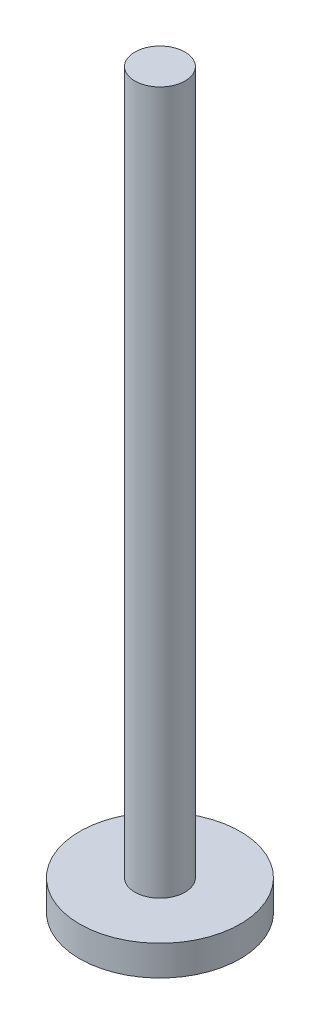
ISO-10303-21;
HEADER;
FILE_DESCRIPTION(('STEP AP214'),'2;1');
FILE_NAME('part.step','',(''),(''),'','','');
FILE_SCHEMA(('AUTOMOTIVE_DESIGN { 1 0 10303 214 1 1 1 1 }'));
ENDSEC;
DATA;
#1=APPLICATION_CONTEXT('core data for automotive mechanical design processes');
#2=APPLICATION_PROTOCOL_DEFINITION('international standard','automotive_design',2000,#1);
#3=PRODUCT_CONTEXT('',#1,'mechanical');
#4=PRODUCT('Part','Part','',(#3));
#5=PRODUCT_RELATED_PRODUCT_CATEGORY('part','',(#4));
#6=PRODUCT_DEFINITION_FORMATION('','',#4);
#7=PRODUCT_DEFINITION_CONTEXT('part definition',#1,'design');
#8=PRODUCT_DEFINITION('design','',#6,#7);
#9=PRODUCT_DEFINITION_SHAPE('','',#8);
#10=(LENGTH_UNIT() NAMED_UNIT(*) SI_UNIT(.MILLI.,.METRE.));
#11=(NAMED_UNIT(*) PLANE_ANGLE_UNIT() SI_UNIT($,.RADIAN.));
#12=(NAMED_UNIT(*) SI_UNIT($,.STERADIAN.) SOLID_ANGLE_UNIT());
#13=UNCERTAINTY_MEASURE_WITH_UNIT(LENGTH_MEASURE(1.E-05),#10,'distance_accuracy_value','');
#14=(GEOMETRIC_REPRESENTATION_CONTEXT(3) GLOBAL_UNCERTAINTY_ASSIGNED_CONTEXT((#13)) GLOBAL_UNIT_ASSIGNED_CONTEXT((#10,
#11,#12)) REPRESENTATION_CONTEXT('',''));
#15=CARTESIAN_POINT('',(0.,0.,0.));
#16=DIRECTION('',(0.,0.,1.));
#17=DIRECTION('',(1.,0.,0.));
#18=AXIS2_PLACEMENT_3D('',#15,#16,#17);
#19=CARTESIAN_POINT('',(0.,3.,0.));
#20=DIRECTION('',(0.,-1.,0.));
#21=DIRECTION('',(0.,0.,-1.));
#22=AXIS2_PLACEMENT_3D('',#19,#20,#21);
#23=CYLINDRICAL_SURFACE('',#22,8.);
#24=CARTESIAN_POINT('',(0.,3.,0.));
#25=DIRECTION('',(0.,1.,0.));
#26=DIRECTION('',(0.,0.,1.));
#27=AXIS2_PLACEMENT_3D('',#24,#25,#26);
#28=CIRCLE('',#27,8.);
#29=CARTESIAN_POINT('',(0.,3.,8.));
#30=VERTEX_POINT('',#29);
#31=EDGE_CURVE('E10',#30,#30,#28,.T.);
#32=ORIENTED_EDGE('',*,*,#31,.F.);
#33=EDGE_LOOP('',(#32));
#34=FACE_BOUND('',#33,.T.);
#35=CARTESIAN_POINT('',(0.,0.,0.));
#36=DIRECTION('',(0.,1.,0.));
#37=DIRECTION('',(0.,0.,1.));
#38=AXIS2_PLACEMENT_3D('',#35,#36,#37);
#39=CIRCLE('',#38,8.);
#40=CARTESIAN_POINT('',(0.,0.,8.));
#41=VERTEX_POINT('',#40);
#42=EDGE_CURVE('E35',#41,#41,#39,.T.);
#43=ORIENTED_EDGE('',*,*,#42,.T.);
#44=EDGE_LOOP('',(#43));
#45=FACE_BOUND('',#44,.T.);
#46=ADVANCED_FACE('F32',(#34,#45),#23,.T.);
#47=CARTESIAN_POINT('',(0.,3.,0.));
#48=DIRECTION('',(0.,1.,0.));
#49=DIRECTION('',(0.,0.,1.));
#50=AXIS2_PLACEMENT_3D('',#47,#48,#49);
#51=PLANE('',#50);
#52=CARTESIAN_POINT('',(0.,3.,0.));
#53=DIRECTION('',(0.,1.,0.));
#54=DIRECTION('',(0.,0.,1.));
#55=AXIS2_PLACEMENT_3D('',#52,#53,#54);
#56=CIRCLE('',#55,2.5);
#57=CARTESIAN_POINT('',(0.,3.,2.5));
#58=VERTEX_POINT('',#57);
#59=EDGE_CURVE('E44',#58,#58,#56,.T.);
#60=ORIENTED_EDGE('',*,*,#59,.F.);
#61=EDGE_LOOP('',(#60));
#62=FACE_BOUND('',#61,.T.);
#63=ORIENTED_EDGE('',*,*,#31,.T.);
#64=EDGE_LOOP('',(#63));
#65=FACE_BOUND('',#64,.T.);
#66=ADVANCED_FACE('F59',(#62,#65),#51,.T.);
#67=CARTESIAN_POINT('',(0.,0.,0.));
#68=DIRECTION('',(0.,1.,0.));
#69=DIRECTION('',(0.,0.,1.));
#70=AXIS2_PLACEMENT_3D('',#67,#68,#69);
#71=PLANE('',#70);
#72=ORIENTED_EDGE('',*,*,#42,.F.);
#73=EDGE_LOOP('',(#72));
#74=FACE_BOUND('',#73,.T.);
#75=ADVANCED_FACE('F55',(#74),#71,.F.);
#76=CARTESIAN_POINT('',(0.,73.,0.));
#77=DIRECTION('',(0.,-1.,0.));
#78=DIRECTION('',(0.,0.,-1.));
#79=AXIS2_PLACEMENT_3D('',#76,#77,#78);
#80=CYLINDRICAL_SURFACE('',#79,2.5);
#81=CARTESIAN_POINT('',(0.,73.,0.));
#82=DIRECTION('',(0.,1.,0.));
#83=DIRECTION('',(0.,0.,1.));
#84=AXIS2_PLACEMENT_3D('',#81,#82,#83);
#85=CIRCLE('',#84,2.5);
#86=CARTESIAN_POINT('',(0.,73.,2.5));
#87=VERTEX_POINT('',#86);
#88=EDGE_CURVE('E42',#87,#87,#85,.T.);
#89=ORIENTED_EDGE('',*,*,#88,.F.);
#90=EDGE_LOOP('',(#89));
#91=FACE_BOUND('',#90,.T.);
#92=ORIENTED_EDGE('',*,*,#59,.T.);
#93=EDGE_LOOP('',(#92));
#94=FACE_BOUND('',#93,.T.);
#95=ADVANCED_FACE('F52',(#91,#94),#80,.T.);
#96=CARTESIAN_POINT('',(0.,73.,0.));
#97=DIRECTION('',(0.,1.,0.));
#98=DIRECTION('',(0.,0.,1.));
#99=AXIS2_PLACEMENT_3D('',#96,#97,#98);
#100=PLANE('',#99);
#101=ORIENTED_EDGE('',*,*,#88,.T.);
#102=EDGE_LOOP('',(#101));
#103=FACE_BOUND('',#102,.T.);
#104=ADVANCED_FACE('F50',(#103),#100,.T.);
#105=CLOSED_SHELL('',(#46,#66,#75,#95,#104));
#106=MANIFOLD_SOLID_BREP('B2',#105);
#107=ADVANCED_BREP_SHAPE_REPRESENTATION('',(#18,#106),#14);
#108=SHAPE_DEFINITION_REPRESENTATION(#9,#107);
ENDSEC;
END-ISO-10303-21;
